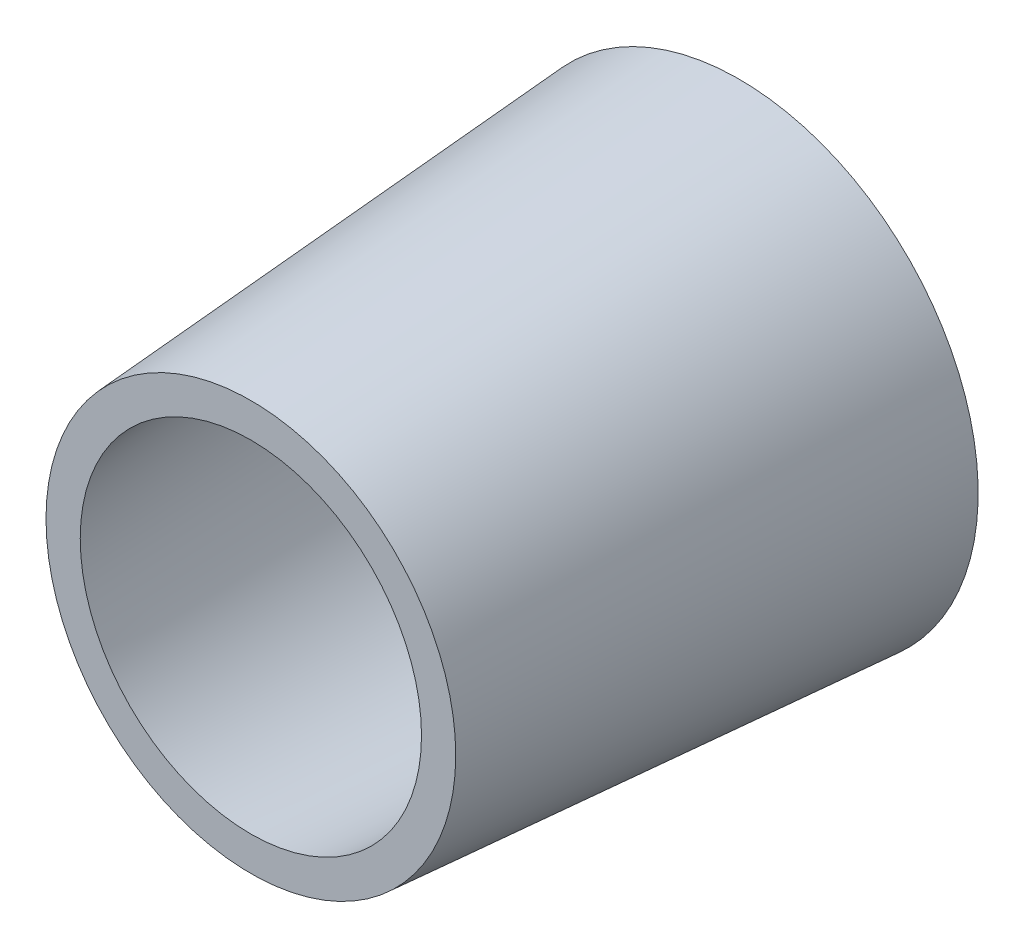
ISO-10303-21;
HEADER;
FILE_DESCRIPTION(('STEP AP214'),'2;1');
FILE_NAME('part.step','',(''),(''),'','','');
FILE_SCHEMA(('AUTOMOTIVE_DESIGN { 1 0 10303 214 1 1 1 1 }'));
ENDSEC;
DATA;
#1=APPLICATION_CONTEXT('core data for automotive mechanical design processes');
#2=APPLICATION_PROTOCOL_DEFINITION('international standard','automotive_design',2000,#1);
#3=PRODUCT_CONTEXT('',#1,'mechanical');
#4=PRODUCT('Part','Part','',(#3));
#5=PRODUCT_RELATED_PRODUCT_CATEGORY('part','',(#4));
#6=PRODUCT_DEFINITION_FORMATION('','',#4);
#7=PRODUCT_DEFINITION_CONTEXT('part definition',#1,'design');
#8=PRODUCT_DEFINITION('design','',#6,#7);
#9=PRODUCT_DEFINITION_SHAPE('','',#8);
#10=(LENGTH_UNIT() NAMED_UNIT(*) SI_UNIT(.MILLI.,.METRE.));
#11=(NAMED_UNIT(*) PLANE_ANGLE_UNIT() SI_UNIT($,.RADIAN.));
#12=(NAMED_UNIT(*) SI_UNIT($,.STERADIAN.) SOLID_ANGLE_UNIT());
#13=UNCERTAINTY_MEASURE_WITH_UNIT(LENGTH_MEASURE(1.E-05),#10,'distance_accuracy_value','');
#14=(GEOMETRIC_REPRESENTATION_CONTEXT(3) GLOBAL_UNCERTAINTY_ASSIGNED_CONTEXT((#13)) GLOBAL_UNIT_ASSIGNED_CONTEXT((#10,
#11,#12)) REPRESENTATION_CONTEXT('',''));
#15=CARTESIAN_POINT('',(0.,0.,0.));
#16=DIRECTION('',(0.,0.,1.));
#17=DIRECTION('',(1.,0.,0.));
#18=AXIS2_PLACEMENT_3D('',#15,#16,#17);
#19=CARTESIAN_POINT('',(0.,17.78,0.));
#20=DIRECTION('',(0.,0.,-1.));
#21=DIRECTION('',(-1.,0.,0.));
#22=AXIS2_PLACEMENT_3D('',#19,#20,#21);
#23=PLANE('',#22);
#24=CARTESIAN_POINT('',(0.,0.,0.));
#25=DIRECTION('',(0.,0.,-1.));
#26=DIRECTION('',(-1.,0.,0.));
#27=AXIS2_PLACEMENT_3D('',#24,#25,#26);
#28=CIRCLE('',#27,15.2337975788738);
#29=CARTESIAN_POINT('',(-15.2337975788738,0.,0.));
#30=VERTEX_POINT('',#29);
#31=EDGE_CURVE('E62',#30,#30,#28,.T.);
#32=ORIENTED_EDGE('',*,*,#31,.F.);
#33=EDGE_LOOP('',(#32));
#34=FACE_BOUND('',#33,.T.);
#35=CARTESIAN_POINT('',(0.,0.,0.));
#36=DIRECTION('',(0.,0.,-1.));
#37=DIRECTION('',(-1.,0.,0.));
#38=AXIS2_PLACEMENT_3D('',#35,#36,#37);
#39=CIRCLE('',#38,17.78);
#40=CARTESIAN_POINT('',(-17.78,0.,0.));
#41=VERTEX_POINT('',#40);
#42=EDGE_CURVE('E52',#41,#41,#39,.T.);
#43=ORIENTED_EDGE('',*,*,#42,.T.);
#44=EDGE_LOOP('',(#43));
#45=FACE_BOUND('',#44,.T.);
#46=ADVANCED_FACE('F45',(#34,#45),#23,.T.);
#47=CARTESIAN_POINT('',(0.,0.,36.3236922920518));
#48=DIRECTION('',(0.,0.,1.));
#49=DIRECTION('',(1.,0.,0.));
#50=AXIS2_PLACEMENT_3D('',#47,#48,#49);
#51=PLANE('',#50);
#52=CARTESIAN_POINT('',(0.,0.,36.3236922920518));
#53=DIRECTION('',(0.,0.,1.));
#54=DIRECTION('',(1.,0.,0.));
#55=AXIS2_PLACEMENT_3D('',#52,#53,#54);
#56=CIRCLE('',#55,12.6937975788738);
#57=CARTESIAN_POINT('',(12.6937975788738,0.,36.3236922920518));
#58=VERTEX_POINT('',#57);
#59=EDGE_CURVE('E57',#58,#58,#56,.F.);
#60=ORIENTED_EDGE('',*,*,#59,.T.);
#61=EDGE_LOOP('',(#60));
#62=FACE_BOUND('',#61,.T.);
#63=CARTESIAN_POINT('',(0.,0.,36.3236922920519));
#64=DIRECTION('',(0.,0.,-1.));
#65=DIRECTION('',(-1.,0.,0.));
#66=AXIS2_PLACEMENT_3D('',#63,#64,#65);
#67=CIRCLE('',#66,15.24);
#68=CARTESIAN_POINT('',(-15.24,0.,36.3236922920519));
#69=VERTEX_POINT('',#68);
#70=EDGE_CURVE('E10',#69,#69,#67,.T.);
#71=ORIENTED_EDGE('',*,*,#70,.F.);
#72=EDGE_LOOP('',(#71));
#73=FACE_BOUND('',#72,.T.);
#74=ADVANCED_FACE('F72',(#62,#73),#51,.T.);
#75=CARTESIAN_POINT('',(0.,0.,0.));
#76=DIRECTION('',(0.,0.,-1.));
#77=DIRECTION('',(-1.,0.,0.));
#78=AXIS2_PLACEMENT_3D('',#75,#76,#77);
#79=CONICAL_SURFACE('',#78,17.78,0.0698131700797663);
#80=ORIENTED_EDGE('',*,*,#70,.T.);
#81=EDGE_LOOP('',(#80));
#82=FACE_BOUND('',#81,.T.);
#83=ORIENTED_EDGE('',*,*,#42,.F.);
#84=EDGE_LOOP('',(#83));
#85=FACE_BOUND('',#84,.T.);
#86=ADVANCED_FACE('F77',(#82,#85),#79,.T.);
#87=CARTESIAN_POINT('',(0.,0.,-0.177181443310063));
#88=DIRECTION('',(0.,0.,-1.));
#89=DIRECTION('',(-1.,0.,0.));
#90=AXIS2_PLACEMENT_3D('',#87,#88,#89);
#91=CONICAL_SURFACE('',#90,15.24618731234,0.0698131700797663);
#92=ORIENTED_EDGE('',*,*,#59,.F.);
#93=EDGE_LOOP('',(#92));
#94=FACE_BOUND('',#93,.T.);
#95=ORIENTED_EDGE('',*,*,#31,.T.);
#96=EDGE_LOOP('',(#95));
#97=FACE_BOUND('',#96,.T.);
#98=ADVANCED_FACE('F69',(#94,#97),#91,.F.);
#99=CLOSED_SHELL('',(#46,#74,#86,#98));
#100=MANIFOLD_SOLID_BREP('B2',#99);
#101=ADVANCED_BREP_SHAPE_REPRESENTATION('',(#18,#100),#14);
#102=SHAPE_DEFINITION_REPRESENTATION(#9,#101);
ENDSEC;
END-ISO-10303-21;
